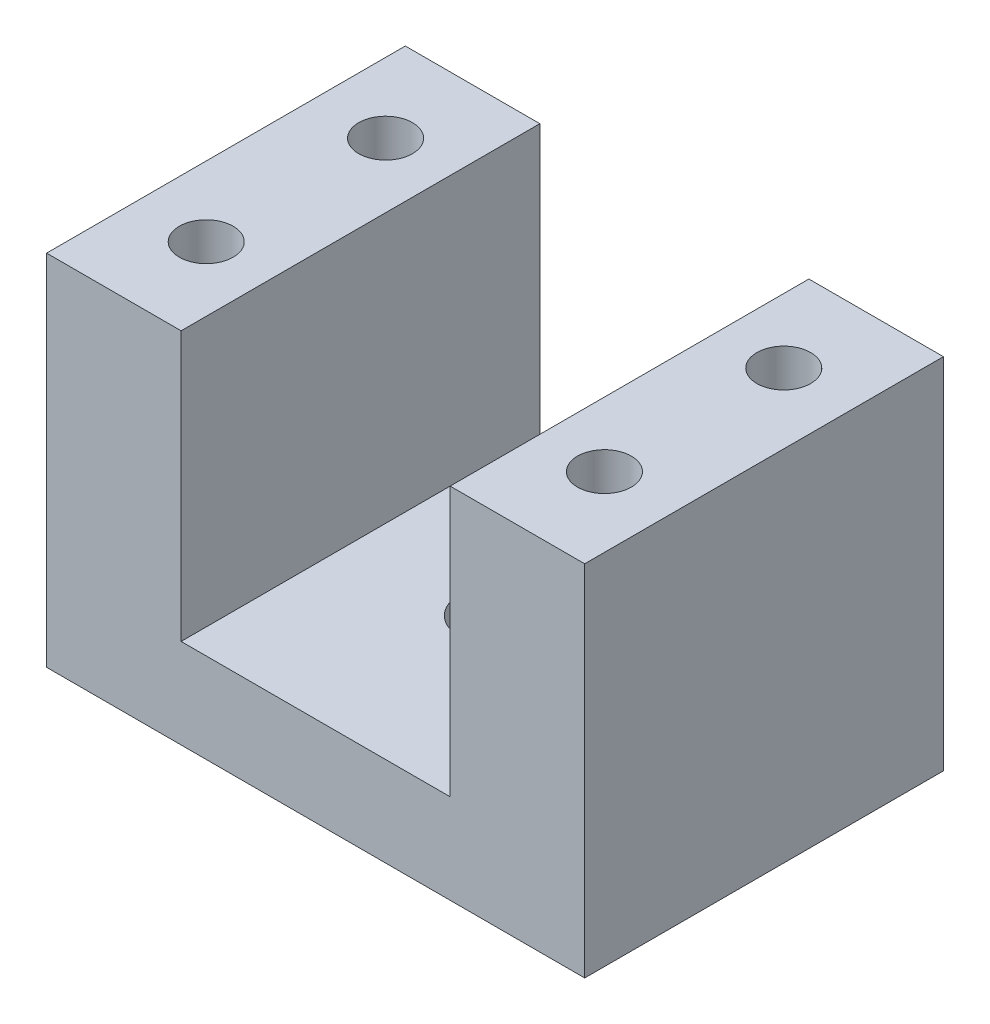
ISO-10303-21;
HEADER;
FILE_DESCRIPTION(('STEP AP214'),'2;1');
FILE_NAME('part.step','',(''),(''),'','','');
FILE_SCHEMA(('AUTOMOTIVE_DESIGN { 1 0 10303 214 1 1 1 1 }'));
ENDSEC;
DATA;
#1=APPLICATION_CONTEXT('core data for automotive mechanical design processes');
#2=APPLICATION_PROTOCOL_DEFINITION('international standard','automotive_design',2000,#1);
#3=PRODUCT_CONTEXT('',#1,'mechanical');
#4=PRODUCT('Part','Part','',(#3));
#5=PRODUCT_RELATED_PRODUCT_CATEGORY('part','',(#4));
#6=PRODUCT_DEFINITION_FORMATION('','',#4);
#7=PRODUCT_DEFINITION_CONTEXT('part definition',#1,'design');
#8=PRODUCT_DEFINITION('design','',#6,#7);
#9=PRODUCT_DEFINITION_SHAPE('','',#8);
#10=(LENGTH_UNIT() NAMED_UNIT(*) SI_UNIT(.MILLI.,.METRE.));
#11=(NAMED_UNIT(*) PLANE_ANGLE_UNIT() SI_UNIT($,.RADIAN.));
#12=(NAMED_UNIT(*) SI_UNIT($,.STERADIAN.) SOLID_ANGLE_UNIT());
#13=UNCERTAINTY_MEASURE_WITH_UNIT(LENGTH_MEASURE(1.E-05),#10,'distance_accuracy_value','');
#14=(GEOMETRIC_REPRESENTATION_CONTEXT(3) GLOBAL_UNCERTAINTY_ASSIGNED_CONTEXT((#13)) GLOBAL_UNIT_ASSIGNED_CONTEXT((#10,
#11,#12)) REPRESENTATION_CONTEXT('',''));
#15=CARTESIAN_POINT('',(0.,0.,0.));
#16=DIRECTION('',(0.,0.,1.));
#17=DIRECTION('',(1.,0.,0.));
#18=AXIS2_PLACEMENT_3D('',#15,#16,#17);
#19=CARTESIAN_POINT('',(-7.5,0.,10.));
#20=DIRECTION('',(-1.,0.,0.));
#21=DIRECTION('',(0.,-1.,0.));
#22=AXIS2_PLACEMENT_3D('',#19,#20,#21);
#23=PLANE('',#22);
#24=DIRECTION('',(0.,1.,0.));
#25=VECTOR('',#24,1.);
#26=CARTESIAN_POINT('',(-7.5,0.,-10.));
#27=LINE('',#26,#25);
#28=CARTESIAN_POINT('',(-7.5,0.,-10.));
#29=VERTEX_POINT('',#28);
#30=CARTESIAN_POINT('',(-7.5,15.,-10.));
#31=VERTEX_POINT('',#30);
#32=EDGE_CURVE('E131',#29,#31,#27,.T.);
#33=ORIENTED_EDGE('',*,*,#32,.T.);
#34=DIRECTION('',(0.,0.,-1.));
#35=VECTOR('',#34,1.);
#36=CARTESIAN_POINT('',(-7.5,15.,10.));
#37=LINE('',#36,#35);
#38=CARTESIAN_POINT('',(-7.5,15.,10.));
#39=VERTEX_POINT('',#38);
#40=EDGE_CURVE('E11',#39,#31,#37,.T.);
#41=ORIENTED_EDGE('',*,*,#40,.F.);
#42=DIRECTION('',(0.,1.,0.));
#43=VECTOR('',#42,1.);
#44=CARTESIAN_POINT('',(-7.5,0.,10.));
#45=LINE('',#44,#43);
#46=CARTESIAN_POINT('',(-7.5,0.,10.));
#47=VERTEX_POINT('',#46);
#48=EDGE_CURVE('E146',#47,#39,#45,.T.);
#49=ORIENTED_EDGE('',*,*,#48,.F.);
#50=DIRECTION('',(0.,0.,-1.));
#51=VECTOR('',#50,1.);
#52=CARTESIAN_POINT('',(-7.5,0.,10.));
#53=LINE('',#52,#51);
#54=EDGE_CURVE('E127',#47,#29,#53,.T.);
#55=ORIENTED_EDGE('',*,*,#54,.T.);
#56=EDGE_LOOP('',(#33,#41,#49,#55));
#57=FACE_BOUND('',#56,.T.);
#58=ADVANCED_FACE('F35',(#57),#23,.F.);
#59=CARTESIAN_POINT('',(-7.5,15.,10.));
#60=DIRECTION('',(0.,-1.,0.));
#61=DIRECTION('',(1.,0.,0.));
#62=AXIS2_PLACEMENT_3D('',#59,#60,#61);
#63=PLANE('',#62);
#64=CARTESIAN_POINT('',(-11.1,15.,5.));
#65=DIRECTION('',(0.,1.,0.));
#66=DIRECTION('',(1.,0.,0.));
#67=AXIS2_PLACEMENT_3D('',#64,#65,#66);
#68=CIRCLE('',#67,1.5);
#69=CARTESIAN_POINT('',(-9.60000000000001,15.,5.));
#70=VERTEX_POINT('',#69);
#71=EDGE_CURVE('E185',#70,#70,#68,.T.);
#72=ORIENTED_EDGE('',*,*,#71,.F.);
#73=EDGE_LOOP('',(#72));
#74=FACE_BOUND('',#73,.T.);
#75=CARTESIAN_POINT('',(-11.1,15.,-5.));
#76=DIRECTION('',(0.,1.,0.));
#77=DIRECTION('',(-1.,0.,0.));
#78=AXIS2_PLACEMENT_3D('',#75,#76,#77);
#79=CIRCLE('',#78,1.5);
#80=CARTESIAN_POINT('',(-12.6,15.,-5.));
#81=VERTEX_POINT('',#80);
#82=EDGE_CURVE('E179',#81,#81,#79,.T.);
#83=ORIENTED_EDGE('',*,*,#82,.F.);
#84=EDGE_LOOP('',(#83));
#85=FACE_BOUND('',#84,.T.);
#86=DIRECTION('',(-1.,0.,0.));
#87=VECTOR('',#86,1.);
#88=CARTESIAN_POINT('',(-7.5,15.,-10.));
#89=LINE('',#88,#87);
#90=CARTESIAN_POINT('',(-15.,15.,-10.));
#91=VERTEX_POINT('',#90);
#92=EDGE_CURVE('E134',#31,#91,#89,.T.);
#93=ORIENTED_EDGE('',*,*,#92,.T.);
#94=DIRECTION('',(0.,0.,-1.));
#95=VECTOR('',#94,1.);
#96=CARTESIAN_POINT('',(-15.,15.,10.));
#97=LINE('',#96,#95);
#98=CARTESIAN_POINT('',(-15.,15.,10.));
#99=VERTEX_POINT('',#98);
#100=EDGE_CURVE('E43',#99,#91,#97,.T.);
#101=ORIENTED_EDGE('',*,*,#100,.F.);
#102=DIRECTION('',(-1.,0.,0.));
#103=VECTOR('',#102,1.);
#104=CARTESIAN_POINT('',(-7.5,15.,10.));
#105=LINE('',#104,#103);
#106=EDGE_CURVE('E94',#39,#99,#105,.T.);
#107=ORIENTED_EDGE('',*,*,#106,.F.);
#108=ORIENTED_EDGE('',*,*,#40,.T.);
#109=EDGE_LOOP('',(#93,#101,#107,#108));
#110=FACE_BOUND('',#109,.T.);
#111=ADVANCED_FACE('F223',(#74,#85,#110),#63,.F.);
#112=CARTESIAN_POINT('',(-15.,15.,10.));
#113=DIRECTION('',(1.,0.,0.));
#114=DIRECTION('',(0.,1.,0.));
#115=AXIS2_PLACEMENT_3D('',#112,#113,#114);
#116=PLANE('',#115);
#117=DIRECTION('',(0.,-1.,0.));
#118=VECTOR('',#117,1.);
#119=CARTESIAN_POINT('',(-15.,15.,-10.));
#120=LINE('',#119,#118);
#121=CARTESIAN_POINT('',(-15.,-5.,-10.));
#122=VERTEX_POINT('',#121);
#123=EDGE_CURVE('E137',#91,#122,#120,.T.);
#124=ORIENTED_EDGE('',*,*,#123,.T.);
#125=DIRECTION('',(0.,0.,-1.));
#126=VECTOR('',#125,1.);
#127=CARTESIAN_POINT('',(-15.,-5.,10.));
#128=LINE('',#127,#126);
#129=CARTESIAN_POINT('',(-15.,-5.,10.));
#130=VERTEX_POINT('',#129);
#131=EDGE_CURVE('E153',#130,#122,#128,.T.);
#132=ORIENTED_EDGE('',*,*,#131,.F.);
#133=DIRECTION('',(0.,-1.,0.));
#134=VECTOR('',#133,1.);
#135=CARTESIAN_POINT('',(-15.,15.,10.));
#136=LINE('',#135,#134);
#137=EDGE_CURVE('E161',#99,#130,#136,.T.);
#138=ORIENTED_EDGE('',*,*,#137,.F.);
#139=ORIENTED_EDGE('',*,*,#100,.T.);
#140=EDGE_LOOP('',(#124,#132,#138,#139));
#141=FACE_BOUND('',#140,.T.);
#142=ADVANCED_FACE('F159',(#141),#116,.F.);
#143=CARTESIAN_POINT('',(-15.,-5.,10.));
#144=DIRECTION('',(0.,1.,0.));
#145=DIRECTION('',(-1.,0.,0.));
#146=AXIS2_PLACEMENT_3D('',#143,#144,#145);
#147=PLANE('',#146);
#148=CARTESIAN_POINT('',(0.,-5.,0.));
#149=DIRECTION('',(0.,1.,0.));
#150=DIRECTION('',(-1.,0.,0.));
#151=AXIS2_PLACEMENT_3D('',#148,#149,#150);
#152=CIRCLE('',#151,2.);
#153=CARTESIAN_POINT('',(-2.,-5.,0.));
#154=VERTEX_POINT('',#153);
#155=EDGE_CURVE('E189',#154,#154,#152,.F.);
#156=ORIENTED_EDGE('',*,*,#155,.F.);
#157=EDGE_LOOP('',(#156));
#158=FACE_BOUND('',#157,.T.);
#159=DIRECTION('',(1.,0.,0.));
#160=VECTOR('',#159,1.);
#161=CARTESIAN_POINT('',(-15.,-5.,-10.));
#162=LINE('',#161,#160);
#163=CARTESIAN_POINT('',(15.,-5.,-10.));
#164=VERTEX_POINT('',#163);
#165=EDGE_CURVE('E139',#122,#164,#162,.T.);
#166=ORIENTED_EDGE('',*,*,#165,.T.);
#167=DIRECTION('',(0.,0.,-1.));
#168=VECTOR('',#167,1.);
#169=CARTESIAN_POINT('',(15.,-5.,10.));
#170=LINE('',#169,#168);
#171=CARTESIAN_POINT('',(15.,-5.,10.));
#172=VERTEX_POINT('',#171);
#173=EDGE_CURVE('E150',#172,#164,#170,.T.);
#174=ORIENTED_EDGE('',*,*,#173,.F.);
#175=DIRECTION('',(1.,0.,0.));
#176=VECTOR('',#175,1.);
#177=CARTESIAN_POINT('',(-15.,-5.,10.));
#178=LINE('',#177,#176);
#179=EDGE_CURVE('E173',#130,#172,#178,.T.);
#180=ORIENTED_EDGE('',*,*,#179,.F.);
#181=ORIENTED_EDGE('',*,*,#131,.T.);
#182=EDGE_LOOP('',(#166,#174,#180,#181));
#183=FACE_BOUND('',#182,.T.);
#184=ADVANCED_FACE('F169',(#158,#183),#147,.F.);
#185=CARTESIAN_POINT('',(15.,15.,10.));
#186=DIRECTION('',(-1.,0.,0.));
#187=DIRECTION('',(0.,-1.,0.));
#188=AXIS2_PLACEMENT_3D('',#185,#186,#187);
#189=PLANE('',#188);
#190=DIRECTION('',(0.,1.,0.));
#191=VECTOR('',#190,1.);
#192=CARTESIAN_POINT('',(15.,15.,-10.));
#193=LINE('',#192,#191);
#194=CARTESIAN_POINT('',(15.,15.,-10.));
#195=VERTEX_POINT('',#194);
#196=EDGE_CURVE('E141',#164,#195,#193,.T.);
#197=ORIENTED_EDGE('',*,*,#196,.T.);
#198=DIRECTION('',(0.,0.,-1.));
#199=VECTOR('',#198,1.);
#200=CARTESIAN_POINT('',(15.,15.,10.));
#201=LINE('',#200,#199);
#202=CARTESIAN_POINT('',(15.,15.,10.));
#203=VERTEX_POINT('',#202);
#204=EDGE_CURVE('E122',#203,#195,#201,.T.);
#205=ORIENTED_EDGE('',*,*,#204,.F.);
#206=DIRECTION('',(0.,1.,0.));
#207=VECTOR('',#206,1.);
#208=CARTESIAN_POINT('',(15.,15.,10.));
#209=LINE('',#208,#207);
#210=EDGE_CURVE('E113',#172,#203,#209,.T.);
#211=ORIENTED_EDGE('',*,*,#210,.F.);
#212=ORIENTED_EDGE('',*,*,#173,.T.);
#213=EDGE_LOOP('',(#197,#205,#211,#212));
#214=FACE_BOUND('',#213,.T.);
#215=ADVANCED_FACE('F172',(#214),#189,.F.);
#216=CARTESIAN_POINT('',(7.5,15.,10.));
#217=DIRECTION('',(0.,-1.,0.));
#218=DIRECTION('',(1.,0.,0.));
#219=AXIS2_PLACEMENT_3D('',#216,#217,#218);
#220=PLANE('',#219);
#221=CARTESIAN_POINT('',(11.1,15.,-5.));
#222=DIRECTION('',(0.,1.,0.));
#223=DIRECTION('',(1.,0.,0.));
#224=AXIS2_PLACEMENT_3D('',#221,#222,#223);
#225=CIRCLE('',#224,1.5);
#226=CARTESIAN_POINT('',(12.6,15.,-5.));
#227=VERTEX_POINT('',#226);
#228=EDGE_CURVE('E192',#227,#227,#225,.T.);
#229=ORIENTED_EDGE('',*,*,#228,.F.);
#230=EDGE_LOOP('',(#229));
#231=FACE_BOUND('',#230,.T.);
#232=CARTESIAN_POINT('',(11.1,15.,5.));
#233=DIRECTION('',(0.,1.,0.));
#234=DIRECTION('',(-1.,0.,0.));
#235=AXIS2_PLACEMENT_3D('',#232,#233,#234);
#236=CIRCLE('',#235,1.5);
#237=CARTESIAN_POINT('',(9.6,15.,5.));
#238=VERTEX_POINT('',#237);
#239=EDGE_CURVE('E198',#238,#238,#236,.T.);
#240=ORIENTED_EDGE('',*,*,#239,.F.);
#241=EDGE_LOOP('',(#240));
#242=FACE_BOUND('',#241,.T.);
#243=DIRECTION('',(-1.,0.,0.));
#244=VECTOR('',#243,1.);
#245=CARTESIAN_POINT('',(7.5,15.,-10.));
#246=LINE('',#245,#244);
#247=CARTESIAN_POINT('',(7.5,15.,-10.));
#248=VERTEX_POINT('',#247);
#249=EDGE_CURVE('E121',#195,#248,#246,.T.);
#250=ORIENTED_EDGE('',*,*,#249,.T.);
#251=DIRECTION('',(0.,0.,-1.));
#252=VECTOR('',#251,1.);
#253=CARTESIAN_POINT('',(7.5,15.,10.));
#254=LINE('',#253,#252);
#255=CARTESIAN_POINT('',(7.5,15.,10.));
#256=VERTEX_POINT('',#255);
#257=EDGE_CURVE('E118',#256,#248,#254,.T.);
#258=ORIENTED_EDGE('',*,*,#257,.F.);
#259=DIRECTION('',(-1.,0.,0.));
#260=VECTOR('',#259,1.);
#261=CARTESIAN_POINT('',(7.5,15.,10.));
#262=LINE('',#261,#260);
#263=EDGE_CURVE('E107',#203,#256,#262,.T.);
#264=ORIENTED_EDGE('',*,*,#263,.F.);
#265=ORIENTED_EDGE('',*,*,#204,.T.);
#266=EDGE_LOOP('',(#250,#258,#264,#265));
#267=FACE_BOUND('',#266,.T.);
#268=ADVANCED_FACE('F119',(#231,#242,#267),#220,.F.);
#269=CARTESIAN_POINT('',(7.5,0.,10.));
#270=DIRECTION('',(1.,0.,0.));
#271=DIRECTION('',(0.,1.,0.));
#272=AXIS2_PLACEMENT_3D('',#269,#270,#271);
#273=PLANE('',#272);
#274=DIRECTION('',(0.,-1.,0.));
#275=VECTOR('',#274,1.);
#276=CARTESIAN_POINT('',(7.5,0.,-10.));
#277=LINE('',#276,#275);
#278=CARTESIAN_POINT('',(7.5,0.,-10.));
#279=VERTEX_POINT('',#278);
#280=EDGE_CURVE('E80',#248,#279,#277,.T.);
#281=ORIENTED_EDGE('',*,*,#280,.T.);
#282=DIRECTION('',(0.,0.,-1.));
#283=VECTOR('',#282,1.);
#284=CARTESIAN_POINT('',(7.5,0.,10.));
#285=LINE('',#284,#283);
#286=CARTESIAN_POINT('',(7.5,0.,10.));
#287=VERTEX_POINT('',#286);
#288=EDGE_CURVE('E123',#287,#279,#285,.T.);
#289=ORIENTED_EDGE('',*,*,#288,.F.);
#290=DIRECTION('',(0.,-1.,0.));
#291=VECTOR('',#290,1.);
#292=CARTESIAN_POINT('',(7.5,0.,10.));
#293=LINE('',#292,#291);
#294=EDGE_CURVE('E111',#256,#287,#293,.T.);
#295=ORIENTED_EDGE('',*,*,#294,.F.);
#296=ORIENTED_EDGE('',*,*,#257,.T.);
#297=EDGE_LOOP('',(#281,#289,#295,#296));
#298=FACE_BOUND('',#297,.T.);
#299=ADVANCED_FACE('F125',(#298),#273,.F.);
#300=CARTESIAN_POINT('',(7.5,0.,10.));
#301=DIRECTION('',(0.,-1.,0.));
#302=DIRECTION('',(1.,0.,0.));
#303=AXIS2_PLACEMENT_3D('',#300,#301,#302);
#304=PLANE('',#303);
#305=CARTESIAN_POINT('',(0.,0.,0.));
#306=DIRECTION('',(0.,1.,0.));
#307=DIRECTION('',(-1.,0.,0.));
#308=AXIS2_PLACEMENT_3D('',#305,#306,#307);
#309=CIRCLE('',#308,2.);
#310=CARTESIAN_POINT('',(-2.,0.,0.));
#311=VERTEX_POINT('',#310);
#312=EDGE_CURVE('E205',#311,#311,#309,.T.);
#313=ORIENTED_EDGE('',*,*,#312,.F.);
#314=EDGE_LOOP('',(#313));
#315=FACE_BOUND('',#314,.T.);
#316=DIRECTION('',(-1.,0.,0.));
#317=VECTOR('',#316,1.);
#318=CARTESIAN_POINT('',(7.5,0.,-10.));
#319=LINE('',#318,#317);
#320=EDGE_CURVE('E86',#279,#29,#319,.T.);
#321=ORIENTED_EDGE('',*,*,#320,.T.);
#322=ORIENTED_EDGE('',*,*,#54,.F.);
#323=DIRECTION('',(-1.,0.,0.));
#324=VECTOR('',#323,1.);
#325=CARTESIAN_POINT('',(7.5,0.,10.));
#326=LINE('',#325,#324);
#327=EDGE_CURVE('E51',#287,#47,#326,.T.);
#328=ORIENTED_EDGE('',*,*,#327,.F.);
#329=ORIENTED_EDGE('',*,*,#288,.T.);
#330=EDGE_LOOP('',(#321,#322,#328,#329));
#331=FACE_BOUND('',#330,.T.);
#332=ADVANCED_FACE('F212',(#315,#331),#304,.F.);
#333=CARTESIAN_POINT('',(0.,0.,10.));
#334=DIRECTION('',(0.,0.,1.));
#335=DIRECTION('',(1.,0.,0.));
#336=AXIS2_PLACEMENT_3D('',#333,#334,#335);
#337=PLANE('',#336);
#338=ORIENTED_EDGE('',*,*,#48,.T.);
#339=ORIENTED_EDGE('',*,*,#106,.T.);
#340=ORIENTED_EDGE('',*,*,#137,.T.);
#341=ORIENTED_EDGE('',*,*,#179,.T.);
#342=ORIENTED_EDGE('',*,*,#210,.T.);
#343=ORIENTED_EDGE('',*,*,#263,.T.);
#344=ORIENTED_EDGE('',*,*,#294,.T.);
#345=ORIENTED_EDGE('',*,*,#327,.T.);
#346=EDGE_LOOP('',(#338,#339,#340,#341,#342,#343,#344,#345));
#347=FACE_BOUND('',#346,.T.);
#348=ADVANCED_FACE('F109',(#347),#337,.T.);
#349=CARTESIAN_POINT('',(0.,0.,-10.));
#350=DIRECTION('',(0.,0.,1.));
#351=DIRECTION('',(1.,0.,0.));
#352=AXIS2_PLACEMENT_3D('',#349,#350,#351);
#353=PLANE('',#352);
#354=ORIENTED_EDGE('',*,*,#32,.F.);
#355=ORIENTED_EDGE('',*,*,#320,.F.);
#356=ORIENTED_EDGE('',*,*,#280,.F.);
#357=ORIENTED_EDGE('',*,*,#249,.F.);
#358=ORIENTED_EDGE('',*,*,#196,.F.);
#359=ORIENTED_EDGE('',*,*,#165,.F.);
#360=ORIENTED_EDGE('',*,*,#123,.F.);
#361=ORIENTED_EDGE('',*,*,#92,.F.);
#362=EDGE_LOOP('',(#354,#355,#356,#357,#358,#359,#360,#361));
#363=FACE_BOUND('',#362,.T.);
#364=ADVANCED_FACE('F165',(#363),#353,.F.);
#365=CARTESIAN_POINT('',(11.1,5.,5.));
#366=DIRECTION('',(0.,1.,0.));
#367=DIRECTION('',(-1.,0.,0.));
#368=AXIS2_PLACEMENT_3D('',#365,#366,#367);
#369=CYLINDRICAL_SURFACE('',#368,1.5);
#370=CARTESIAN_POINT('',(11.1,5.,5.));
#371=DIRECTION('',(0.,1.,0.));
#372=DIRECTION('',(-1.,0.,0.));
#373=AXIS2_PLACEMENT_3D('',#370,#371,#372);
#374=CIRCLE('',#373,1.5);
#375=CARTESIAN_POINT('',(9.6,5.,5.));
#376=VERTEX_POINT('',#375);
#377=EDGE_CURVE('E182',#376,#376,#374,.T.);
#378=ORIENTED_EDGE('',*,*,#377,.F.);
#379=EDGE_LOOP('',(#378));
#380=FACE_BOUND('',#379,.T.);
#381=ORIENTED_EDGE('',*,*,#239,.T.);
#382=EDGE_LOOP('',(#381));
#383=FACE_BOUND('',#382,.T.);
#384=ADVANCED_FACE('F251',(#380,#383),#369,.F.);
#385=CARTESIAN_POINT('',(11.1,5.,5.));
#386=DIRECTION('',(0.,1.,0.));
#387=DIRECTION('',(-1.,0.,0.));
#388=AXIS2_PLACEMENT_3D('',#385,#386,#387);
#389=PLANE('',#388);
#390=ORIENTED_EDGE('',*,*,#377,.T.);
#391=EDGE_LOOP('',(#390));
#392=FACE_BOUND('',#391,.T.);
#393=ADVANCED_FACE('F253',(#392),#389,.T.);
#394=CARTESIAN_POINT('',(11.1,5.,-5.));
#395=DIRECTION('',(0.,1.,0.));
#396=DIRECTION('',(-1.,0.,0.));
#397=AXIS2_PLACEMENT_3D('',#394,#395,#396);
#398=CYLINDRICAL_SURFACE('',#397,1.5);
#399=CARTESIAN_POINT('',(11.1,5.,-5.));
#400=DIRECTION('',(0.,1.,0.));
#401=DIRECTION('',(1.,0.,0.));
#402=AXIS2_PLACEMENT_3D('',#399,#400,#401);
#403=CIRCLE('',#402,1.5);
#404=CARTESIAN_POINT('',(12.6,5.,-5.));
#405=VERTEX_POINT('',#404);
#406=EDGE_CURVE('E195',#405,#405,#403,.T.);
#407=ORIENTED_EDGE('',*,*,#406,.F.);
#408=EDGE_LOOP('',(#407));
#409=FACE_BOUND('',#408,.T.);
#410=ORIENTED_EDGE('',*,*,#228,.T.);
#411=EDGE_LOOP('',(#410));
#412=FACE_BOUND('',#411,.T.);
#413=ADVANCED_FACE('F260',(#409,#412),#398,.F.);
#414=CARTESIAN_POINT('',(11.1,5.,-5.));
#415=DIRECTION('',(0.,-1.,0.));
#416=DIRECTION('',(1.,0.,0.));
#417=AXIS2_PLACEMENT_3D('',#414,#415,#416);
#418=PLANE('',#417);
#419=ORIENTED_EDGE('',*,*,#406,.T.);
#420=EDGE_LOOP('',(#419));
#421=FACE_BOUND('',#420,.T.);
#422=ADVANCED_FACE('F266',(#421),#418,.F.);
#423=CARTESIAN_POINT('',(-11.1,5.,-5.));
#424=DIRECTION('',(0.,1.,0.));
#425=DIRECTION('',(-1.,0.,0.));
#426=AXIS2_PLACEMENT_3D('',#423,#424,#425);
#427=CYLINDRICAL_SURFACE('',#426,1.5);
#428=CARTESIAN_POINT('',(-11.1,5.,-5.));
#429=DIRECTION('',(0.,1.,0.));
#430=DIRECTION('',(-1.,0.,0.));
#431=AXIS2_PLACEMENT_3D('',#428,#429,#430);
#432=CIRCLE('',#431,1.5);
#433=CARTESIAN_POINT('',(-12.6,5.,-5.));
#434=VERTEX_POINT('',#433);
#435=EDGE_CURVE('E135',#434,#434,#432,.T.);
#436=ORIENTED_EDGE('',*,*,#435,.F.);
#437=EDGE_LOOP('',(#436));
#438=FACE_BOUND('',#437,.T.);
#439=ORIENTED_EDGE('',*,*,#82,.T.);
#440=EDGE_LOOP('',(#439));
#441=FACE_BOUND('',#440,.T.);
#442=ADVANCED_FACE('F269',(#438,#441),#427,.F.);
#443=CARTESIAN_POINT('',(-11.1,5.,-5.));
#444=DIRECTION('',(0.,1.,0.));
#445=DIRECTION('',(-1.,0.,0.));
#446=AXIS2_PLACEMENT_3D('',#443,#444,#445);
#447=PLANE('',#446);
#448=ORIENTED_EDGE('',*,*,#435,.T.);
#449=EDGE_LOOP('',(#448));
#450=FACE_BOUND('',#449,.T.);
#451=ADVANCED_FACE('F281',(#450),#447,.T.);
#452=CARTESIAN_POINT('',(-11.1,5.,5.));
#453=DIRECTION('',(0.,1.,0.));
#454=DIRECTION('',(-1.,0.,0.));
#455=AXIS2_PLACEMENT_3D('',#452,#453,#454);
#456=CYLINDRICAL_SURFACE('',#455,1.5);
#457=CARTESIAN_POINT('',(-11.1,5.,5.));
#458=DIRECTION('',(0.,1.,0.));
#459=DIRECTION('',(1.,0.,0.));
#460=AXIS2_PLACEMENT_3D('',#457,#458,#459);
#461=CIRCLE('',#460,1.5);
#462=CARTESIAN_POINT('',(-9.60000000000001,5.,5.));
#463=VERTEX_POINT('',#462);
#464=EDGE_CURVE('E188',#463,#463,#461,.T.);
#465=ORIENTED_EDGE('',*,*,#464,.F.);
#466=EDGE_LOOP('',(#465));
#467=FACE_BOUND('',#466,.T.);
#468=ORIENTED_EDGE('',*,*,#71,.T.);
#469=EDGE_LOOP('',(#468));
#470=FACE_BOUND('',#469,.T.);
#471=ADVANCED_FACE('F277',(#467,#470),#456,.F.);
#472=CARTESIAN_POINT('',(-11.1,5.,5.));
#473=DIRECTION('',(0.,-1.,0.));
#474=DIRECTION('',(1.,0.,0.));
#475=AXIS2_PLACEMENT_3D('',#472,#473,#474);
#476=PLANE('',#475);
#477=ORIENTED_EDGE('',*,*,#464,.T.);
#478=EDGE_LOOP('',(#477));
#479=FACE_BOUND('',#478,.T.);
#480=ADVANCED_FACE('F274',(#479),#476,.F.);
#481=CARTESIAN_POINT('',(0.,-5.001,0.));
#482=DIRECTION('',(0.,1.,0.));
#483=DIRECTION('',(-1.,0.,0.));
#484=AXIS2_PLACEMENT_3D('',#481,#482,#483);
#485=CYLINDRICAL_SURFACE('',#484,2.);
#486=ORIENTED_EDGE('',*,*,#312,.T.);
#487=EDGE_LOOP('',(#486));
#488=FACE_BOUND('',#487,.T.);
#489=ORIENTED_EDGE('',*,*,#155,.T.);
#490=EDGE_LOOP('',(#489));
#491=FACE_BOUND('',#490,.T.);
#492=ADVANCED_FACE('F209',(#488,#491),#485,.F.);
#493=CLOSED_SHELL('',(#58,#111,#142,#184,#215,#268,#299,#332,#348,#364,#384,#393,#413,#422,#442,
#451,#471,#480,#492));
#494=MANIFOLD_SOLID_BREP('B2',#493);
#495=ADVANCED_BREP_SHAPE_REPRESENTATION('',(#18,#494),#14);
#496=SHAPE_DEFINITION_REPRESENTATION(#9,#495);
ENDSEC;
END-ISO-10303-21;
